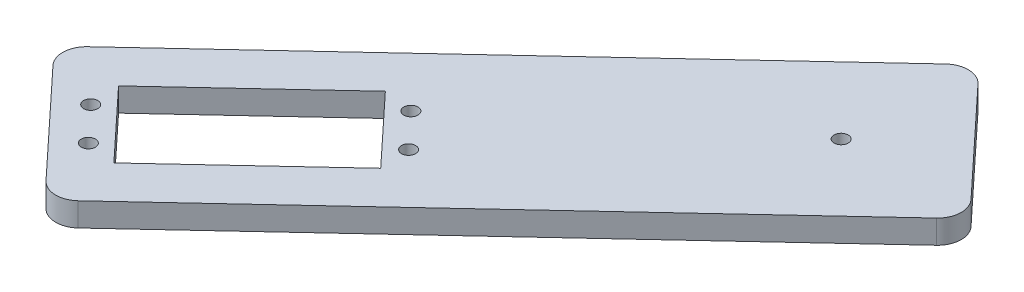
ISO-10303-21;
HEADER;
FILE_DESCRIPTION(('STEP AP214'),'2;1');
FILE_NAME('part.step','',(''),(''),'','','');
FILE_SCHEMA(('AUTOMOTIVE_DESIGN { 1 0 10303 214 1 1 1 1 }'));
ENDSEC;
DATA;
#1=APPLICATION_CONTEXT('core data for automotive mechanical design processes');
#2=APPLICATION_PROTOCOL_DEFINITION('international standard','automotive_design',2000,#1);
#3=PRODUCT_CONTEXT('',#1,'mechanical');
#4=PRODUCT('Part','Part','',(#3));
#5=PRODUCT_RELATED_PRODUCT_CATEGORY('part','',(#4));
#6=PRODUCT_DEFINITION_FORMATION('','',#4);
#7=PRODUCT_DEFINITION_CONTEXT('part definition',#1,'design');
#8=PRODUCT_DEFINITION('design','',#6,#7);
#9=PRODUCT_DEFINITION_SHAPE('','',#8);
#10=(LENGTH_UNIT() NAMED_UNIT(*) SI_UNIT(.MILLI.,.METRE.));
#11=(NAMED_UNIT(*) PLANE_ANGLE_UNIT() SI_UNIT($,.RADIAN.));
#12=(NAMED_UNIT(*) SI_UNIT($,.STERADIAN.) SOLID_ANGLE_UNIT());
#13=UNCERTAINTY_MEASURE_WITH_UNIT(LENGTH_MEASURE(1.E-05),#10,'distance_accuracy_value','');
#14=(GEOMETRIC_REPRESENTATION_CONTEXT(3) GLOBAL_UNCERTAINTY_ASSIGNED_CONTEXT((#13)) GLOBAL_UNIT_ASSIGNED_CONTEXT((#10,
#11,#12)) REPRESENTATION_CONTEXT('',''));
#15=CARTESIAN_POINT('',(0.,0.,0.));
#16=DIRECTION('',(0.,0.,1.));
#17=DIRECTION('',(1.,0.,0.));
#18=AXIS2_PLACEMENT_3D('',#15,#16,#17);
#19=CARTESIAN_POINT('',(-17.5010235742524,5.,23.5376499438813));
#20=DIRECTION('',(0.,-1.,0.));
#21=DIRECTION('',(0.,0.,-1.));
#22=AXIS2_PLACEMENT_3D('',#19,#20,#21);
#23=PLANE('',#22);
#24=CARTESIAN_POINT('',(-68.9460814642246,5.,85.1842171444905));
#25=DIRECTION('',(0.,1.,0.));
#26=DIRECTION('',(0.,0.,1.));
#27=AXIS2_PLACEMENT_3D('',#24,#25,#26);
#28=CIRCLE('',#27,1.50000000000006);
#29=CARTESIAN_POINT('',(-68.9460814642246,5.,86.6842171444906));
#30=VERTEX_POINT('',#29);
#31=EDGE_CURVE('E160',#30,#30,#28,.T.);
#32=ORIENTED_EDGE('',*,*,#31,.F.);
#33=EDGE_LOOP('',(#32));
#34=FACE_BOUND('',#33,.T.);
#35=CARTESIAN_POINT('',(-62.1260978635996,5.,92.4977541606822));
#36=DIRECTION('',(0.,1.,0.));
#37=DIRECTION('',(0.,0.,1.));
#38=AXIS2_PLACEMENT_3D('',#35,#36,#37);
#39=CIRCLE('',#38,1.50000000000006);
#40=CARTESIAN_POINT('',(-62.1260978635996,5.,93.9977541606822));
#41=VERTEX_POINT('',#40);
#42=EDGE_CURVE('E166',#41,#41,#39,.T.);
#43=ORIENTED_EDGE('',*,*,#42,.F.);
#44=EDGE_LOOP('',(#43));
#45=FACE_BOUND('',#44,.T.);
#46=CARTESIAN_POINT('',(-104.051059141945,5.,117.92013842749));
#47=DIRECTION('',(0.,1.,0.));
#48=DIRECTION('',(0.,0.,1.));
#49=AXIS2_PLACEMENT_3D('',#46,#47,#48);
#50=CIRCLE('',#49,1.50000000000006);
#51=CARTESIAN_POINT('',(-104.051059141945,5.,119.42013842749));
#52=VERTEX_POINT('',#51);
#53=EDGE_CURVE('E172',#52,#52,#50,.T.);
#54=ORIENTED_EDGE('',*,*,#53,.F.);
#55=EDGE_LOOP('',(#54));
#56=FACE_BOUND('',#55,.T.);
#57=CARTESIAN_POINT('',(-97.2310755413197,5.,125.233675443682));
#58=DIRECTION('',(0.,1.,0.));
#59=DIRECTION('',(0.,0.,1.));
#60=AXIS2_PLACEMENT_3D('',#57,#58,#59);
#61=CIRCLE('',#60,1.50000000000006);
#62=CARTESIAN_POINT('',(-97.2310755413197,5.,126.733675443682));
#63=VERTEX_POINT('',#62);
#64=EDGE_CURVE('E178',#63,#63,#61,.T.);
#65=ORIENTED_EDGE('',*,*,#64,.F.);
#66=EDGE_LOOP('',(#65));
#67=FACE_BOUND('',#66,.T.);
#68=CARTESIAN_POINT('',(-18.2413536976024,5.,44.7379308691066));
#69=DIRECTION('',(0.,1.,0.));
#70=DIRECTION('',(0.,0.,-1.));
#71=AXIS2_PLACEMENT_3D('',#68,#69,#70);
#72=CIRCLE('',#71,1.5);
#73=CARTESIAN_POINT('',(-18.2413536976024,5.,43.2379308691066));
#74=VERTEX_POINT('',#73);
#75=EDGE_CURVE('E184',#74,#74,#72,.T.);
#76=ORIENTED_EDGE('',*,*,#75,.F.);
#77=EDGE_LOOP('',(#76));
#78=FACE_BOUND('',#77,.T.);
#79=CARTESIAN_POINT('',(-17.5010235742524,5.,23.5376499438813));
#80=DIRECTION('',(0.,1.,0.));
#81=DIRECTION('',(0.,0.,-1.));
#82=AXIS2_PLACEMENT_3D('',#79,#80,#81);
#83=CIRCLE('',#82,5.00000000000009);
#84=CARTESIAN_POINT('',(-13.8442550661566,5.,20.1276581435686));
#85=VERTEX_POINT('',#84);
#86=CARTESIAN_POINT('',(-20.9110153745649,5.,19.8808814357853));
#87=VERTEX_POINT('',#86);
#88=EDGE_CURVE('E190',#85,#87,#83,.T.);
#89=ORIENTED_EDGE('',*,*,#88,.T.);
#90=DIRECTION('',(-0.731353701619178,0.,0.681998360062491));
#91=VECTOR('',#90,1.);
#92=CARTESIAN_POINT('',(-20.9110153745649,5.,19.8808814357853));
#93=LINE('',#92,#91);
#94=CARTESIAN_POINT('',(-115.012388244502,5.,107.631831263265));
#95=VERTEX_POINT('',#94);
#96=EDGE_CURVE('E193',#87,#95,#93,.T.);
#97=ORIENTED_EDGE('',*,*,#96,.T.);
#98=CARTESIAN_POINT('',(-111.602396444189,5.,111.288599771361));
#99=DIRECTION('',(0.,1.,0.));
#100=DIRECTION('',(0.,0.,1.));
#101=AXIS2_PLACEMENT_3D('',#98,#99,#100);
#102=CIRCLE('',#101,5.0000000000001);
#103=CARTESIAN_POINT('',(-115.259164952285,5.,114.698591571673));
#104=VERTEX_POINT('',#103);
#105=EDGE_CURVE('E196',#95,#104,#102,.T.);
#106=ORIENTED_EDGE('',*,*,#105,.T.);
#107=DIRECTION('',(0.681998360062492,0.,0.731353701619177));
#108=VECTOR('',#107,1.);
#109=CARTESIAN_POINT('',(-94.7992141504099,5.,136.639202620249));
#110=LINE('',#109,#108);
#111=CARTESIAN_POINT('',(-94.7992141504099,5.,136.639202620249));
#112=VERTEX_POINT('',#111);
#113=EDGE_CURVE('E198',#104,#112,#110,.T.);
#114=ORIENTED_EDGE('',*,*,#113,.T.);
#115=CARTESIAN_POINT('',(-91.1424456423142,5.,133.229210819936));
#116=DIRECTION('',(0.,1.,0.));
#117=DIRECTION('',(0.,0.,1.));
#118=AXIS2_PLACEMENT_3D('',#115,#116,#117);
#119=CIRCLE('',#118,4.99999999999985);
#120=CARTESIAN_POINT('',(-87.7324538420007,5.,136.885979328031));
#121=VERTEX_POINT('',#120);
#122=EDGE_CURVE('E200',#112,#121,#119,.T.);
#123=ORIENTED_EDGE('',*,*,#122,.T.);
#124=DIRECTION('',(0.731353701619178,0.,-0.681998360062491));
#125=VECTOR('',#124,1.);
#126=CARTESIAN_POINT('',(6.36891902793637,5.,49.1350295005515));
#127=LINE('',#126,#125);
#128=CARTESIAN_POINT('',(6.36891902793637,5.,49.1350295005515));
#129=VERTEX_POINT('',#128);
#130=EDGE_CURVE('E202',#121,#129,#127,.T.);
#131=ORIENTED_EDGE('',*,*,#130,.T.);
#132=CARTESIAN_POINT('',(2.95892722762281,5.,45.4782609924567));
#133=DIRECTION('',(0.,1.,0.));
#134=DIRECTION('',(0.,0.,-1.));
#135=AXIS2_PLACEMENT_3D('',#132,#133,#134);
#136=CIRCLE('',#135,4.99999999999985);
#137=CARTESIAN_POINT('',(6.6156957357186,5.,42.0682691921444));
#138=VERTEX_POINT('',#137);
#139=EDGE_CURVE('E204',#129,#138,#136,.T.);
#140=ORIENTED_EDGE('',*,*,#139,.T.);
#141=DIRECTION('',(-0.681998360062489,0.,-0.731353701619179));
#142=VECTOR('',#141,1.);
#143=CARTESIAN_POINT('',(6.61569573571855,5.,42.0682691921445));
#144=LINE('',#143,#142);
#145=EDGE_CURVE('E206',#138,#85,#144,.T.);
#146=ORIENTED_EDGE('',*,*,#145,.T.);
#147=EDGE_LOOP('',(#89,#97,#106,#114,#123,#131,#140,#146));
#148=FACE_BOUND('',#147,.T.);
#149=DIRECTION('',(0.6819983600625,0.,0.731353701619169));
#150=VECTOR('',#149,1.);
#151=CARTESIAN_POINT('',(-90.8956689345306,5.,126.162450511528));
#152=LINE('',#151,#150);
#153=CARTESIAN_POINT('',(-104.53563613578,5.,111.535376479145));
#154=VERTEX_POINT('',#153);
#155=CARTESIAN_POINT('',(-90.8956689345306,5.,126.162450511528));
#156=VERTEX_POINT('',#155);
#157=EDGE_CURVE('E124',#154,#156,#152,.T.);
#158=ORIENTED_EDGE('',*,*,#157,.F.);
#159=DIRECTION('',(-0.731353701619173,0.,0.681998360062495));
#160=VECTOR('',#159,1.);
#161=CARTESIAN_POINT('',(-75.2814880710133,5.,84.2554420766448));
#162=LINE('',#161,#160);
#163=CARTESIAN_POINT('',(-75.2814880710133,5.,84.2554420766448));
#164=VERTEX_POINT('',#163);
#165=EDGE_CURVE('E146',#164,#154,#162,.T.);
#166=ORIENTED_EDGE('',*,*,#165,.F.);
#167=DIRECTION('',(-0.681998360062495,0.,-0.731353701619174));
#168=VECTOR('',#167,1.);
#169=CARTESIAN_POINT('',(-61.6415208697636,5.,98.8825161090281));
#170=LINE('',#169,#168);
#171=CARTESIAN_POINT('',(-61.6415208697636,5.,98.8825161090281));
#172=VERTEX_POINT('',#171);
#173=EDGE_CURVE('E144',#172,#164,#170,.T.);
#174=ORIENTED_EDGE('',*,*,#173,.F.);
#175=DIRECTION('',(0.731353701619176,0.,-0.681998360062492));
#176=VECTOR('',#175,1.);
#177=CARTESIAN_POINT('',(-90.8956689345306,5.,126.162450511528));
#178=LINE('',#177,#176);
#179=EDGE_CURVE('E132',#156,#172,#178,.T.);
#180=ORIENTED_EDGE('',*,*,#179,.F.);
#181=EDGE_LOOP('',(#158,#166,#174,#180));
#182=FACE_BOUND('',#181,.T.);
#183=ADVANCED_FACE('F35',(#34,#45,#56,#67,#78,#148,#182),#23,.F.);
#184=CARTESIAN_POINT('',(-17.5010235742524,0.,23.5376499438813));
#185=DIRECTION('',(0.,-1.,0.));
#186=DIRECTION('',(0.,0.,-1.));
#187=AXIS2_PLACEMENT_3D('',#184,#185,#186);
#188=PLANE('',#187);
#189=CARTESIAN_POINT('',(-62.1260978635996,0.,92.4977541606822));
#190=DIRECTION('',(0.,1.,0.));
#191=DIRECTION('',(0.,0.,1.));
#192=AXIS2_PLACEMENT_3D('',#189,#190,#191);
#193=CIRCLE('',#192,1.50000000000006);
#194=CARTESIAN_POINT('',(-62.1260978635996,0.,93.9977541606822));
#195=VERTEX_POINT('',#194);
#196=EDGE_CURVE('E163',#195,#195,#193,.T.);
#197=ORIENTED_EDGE('',*,*,#196,.T.);
#198=EDGE_LOOP('',(#197));
#199=FACE_BOUND('',#198,.T.);
#200=CARTESIAN_POINT('',(-97.2310755413197,0.,125.233675443682));
#201=DIRECTION('',(0.,1.,0.));
#202=DIRECTION('',(0.,0.,1.));
#203=AXIS2_PLACEMENT_3D('',#200,#201,#202);
#204=CIRCLE('',#203,1.50000000000006);
#205=CARTESIAN_POINT('',(-97.2310755413197,0.,126.733675443682));
#206=VERTEX_POINT('',#205);
#207=EDGE_CURVE('E175',#206,#206,#204,.T.);
#208=ORIENTED_EDGE('',*,*,#207,.T.);
#209=EDGE_LOOP('',(#208));
#210=FACE_BOUND('',#209,.T.);
#211=CARTESIAN_POINT('',(-17.5010235742524,0.,23.5376499438813));
#212=DIRECTION('',(0.,1.,0.));
#213=DIRECTION('',(0.,0.,-1.));
#214=AXIS2_PLACEMENT_3D('',#211,#212,#213);
#215=CIRCLE('',#214,5.00000000000009);
#216=CARTESIAN_POINT('',(-13.8442550661566,0.,20.1276581435686));
#217=VERTEX_POINT('',#216);
#218=CARTESIAN_POINT('',(-20.9110153745649,0.,19.8808814357853));
#219=VERTEX_POINT('',#218);
#220=EDGE_CURVE('E187',#217,#219,#215,.T.);
#221=ORIENTED_EDGE('',*,*,#220,.F.);
#222=DIRECTION('',(-0.681998360062489,0.,-0.731353701619179));
#223=VECTOR('',#222,1.);
#224=CARTESIAN_POINT('',(6.61569573571855,0.,42.0682691921445));
#225=LINE('',#224,#223);
#226=CARTESIAN_POINT('',(6.6156957357186,0.,42.0682691921444));
#227=VERTEX_POINT('',#226);
#228=EDGE_CURVE('E194',#227,#217,#225,.T.);
#229=ORIENTED_EDGE('',*,*,#228,.F.);
#230=CARTESIAN_POINT('',(2.95892722762281,0.,45.4782609924567));
#231=DIRECTION('',(0.,1.,0.));
#232=DIRECTION('',(0.,0.,-1.));
#233=AXIS2_PLACEMENT_3D('',#230,#231,#232);
#234=CIRCLE('',#233,4.99999999999985);
#235=CARTESIAN_POINT('',(6.36891902793637,0.,49.1350295005515));
#236=VERTEX_POINT('',#235);
#237=EDGE_CURVE('E221',#236,#227,#234,.T.);
#238=ORIENTED_EDGE('',*,*,#237,.F.);
#239=DIRECTION('',(0.731353701619178,0.,-0.681998360062491));
#240=VECTOR('',#239,1.);
#241=CARTESIAN_POINT('',(6.36891902793637,0.,49.1350295005515));
#242=LINE('',#241,#240);
#243=CARTESIAN_POINT('',(-87.7324538420007,0.,136.885979328031));
#244=VERTEX_POINT('',#243);
#245=EDGE_CURVE('E219',#244,#236,#242,.T.);
#246=ORIENTED_EDGE('',*,*,#245,.F.);
#247=CARTESIAN_POINT('',(-91.1424456423142,0.,133.229210819936));
#248=DIRECTION('',(0.,1.,0.));
#249=DIRECTION('',(0.,0.,1.));
#250=AXIS2_PLACEMENT_3D('',#247,#248,#249);
#251=CIRCLE('',#250,4.99999999999985);
#252=CARTESIAN_POINT('',(-94.7992141504099,0.,136.639202620249));
#253=VERTEX_POINT('',#252);
#254=EDGE_CURVE('E217',#253,#244,#251,.T.);
#255=ORIENTED_EDGE('',*,*,#254,.F.);
#256=DIRECTION('',(0.681998360062492,0.,0.731353701619177));
#257=VECTOR('',#256,1.);
#258=CARTESIAN_POINT('',(-94.7992141504099,0.,136.639202620249));
#259=LINE('',#258,#257);
#260=CARTESIAN_POINT('',(-115.259164952285,0.,114.698591571673));
#261=VERTEX_POINT('',#260);
#262=EDGE_CURVE('E215',#261,#253,#259,.T.);
#263=ORIENTED_EDGE('',*,*,#262,.F.);
#264=CARTESIAN_POINT('',(-111.602396444189,0.,111.288599771361));
#265=DIRECTION('',(0.,1.,0.));
#266=DIRECTION('',(0.,0.,1.));
#267=AXIS2_PLACEMENT_3D('',#264,#265,#266);
#268=CIRCLE('',#267,5.0000000000001);
#269=CARTESIAN_POINT('',(-115.012388244502,0.,107.631831263265));
#270=VERTEX_POINT('',#269);
#271=EDGE_CURVE('E213',#270,#261,#268,.T.);
#272=ORIENTED_EDGE('',*,*,#271,.F.);
#273=DIRECTION('',(-0.731353701619178,0.,0.681998360062491));
#274=VECTOR('',#273,1.);
#275=CARTESIAN_POINT('',(-20.9110153745649,0.,19.8808814357853));
#276=LINE('',#275,#274);
#277=EDGE_CURVE('E211',#219,#270,#276,.T.);
#278=ORIENTED_EDGE('',*,*,#277,.F.);
#279=EDGE_LOOP('',(#221,#229,#238,#246,#255,#263,#272,#278));
#280=FACE_BOUND('',#279,.T.);
#281=CARTESIAN_POINT('',(-18.2413536976024,0.,44.7379308691066));
#282=DIRECTION('',(0.,1.,0.));
#283=DIRECTION('',(0.,0.,-1.));
#284=AXIS2_PLACEMENT_3D('',#281,#282,#283);
#285=CIRCLE('',#284,1.5);
#286=CARTESIAN_POINT('',(-18.2413536976024,0.,43.2379308691066));
#287=VERTEX_POINT('',#286);
#288=EDGE_CURVE('E181',#287,#287,#285,.T.);
#289=ORIENTED_EDGE('',*,*,#288,.T.);
#290=EDGE_LOOP('',(#289));
#291=FACE_BOUND('',#290,.T.);
#292=CARTESIAN_POINT('',(-104.051059141945,0.,117.92013842749));
#293=DIRECTION('',(0.,1.,0.));
#294=DIRECTION('',(0.,0.,1.));
#295=AXIS2_PLACEMENT_3D('',#292,#293,#294);
#296=CIRCLE('',#295,1.50000000000006);
#297=CARTESIAN_POINT('',(-104.051059141945,0.,119.42013842749));
#298=VERTEX_POINT('',#297);
#299=EDGE_CURVE('E169',#298,#298,#296,.T.);
#300=ORIENTED_EDGE('',*,*,#299,.T.);
#301=EDGE_LOOP('',(#300));
#302=FACE_BOUND('',#301,.T.);
#303=CARTESIAN_POINT('',(-68.9460814642246,0.,85.1842171444905));
#304=DIRECTION('',(0.,1.,0.));
#305=DIRECTION('',(0.,0.,1.));
#306=AXIS2_PLACEMENT_3D('',#303,#304,#305);
#307=CIRCLE('',#306,1.50000000000006);
#308=CARTESIAN_POINT('',(-68.9460814642246,0.,86.6842171444906));
#309=VERTEX_POINT('',#308);
#310=EDGE_CURVE('E140',#309,#309,#307,.T.);
#311=ORIENTED_EDGE('',*,*,#310,.T.);
#312=EDGE_LOOP('',(#311));
#313=FACE_BOUND('',#312,.T.);
#314=DIRECTION('',(-0.731353701619173,0.,0.681998360062495));
#315=VECTOR('',#314,1.);
#316=CARTESIAN_POINT('',(-75.2814880710133,0.,84.2554420766448));
#317=LINE('',#316,#315);
#318=CARTESIAN_POINT('',(-75.2814880710133,0.,84.2554420766448));
#319=VERTEX_POINT('',#318);
#320=CARTESIAN_POINT('',(-104.53563613578,0.,111.535376479145));
#321=VERTEX_POINT('',#320);
#322=EDGE_CURVE('E133',#319,#321,#317,.T.);
#323=ORIENTED_EDGE('',*,*,#322,.T.);
#324=DIRECTION('',(0.6819983600625,0.,0.731353701619169));
#325=VECTOR('',#324,1.);
#326=CARTESIAN_POINT('',(-90.8956689345306,0.,126.162450511528));
#327=LINE('',#326,#325);
#328=CARTESIAN_POINT('',(-90.8956689345306,0.,126.162450511528));
#329=VERTEX_POINT('',#328);
#330=EDGE_CURVE('E58',#321,#329,#327,.T.);
#331=ORIENTED_EDGE('',*,*,#330,.T.);
#332=DIRECTION('',(0.731353701619176,0.,-0.681998360062492));
#333=VECTOR('',#332,1.);
#334=CARTESIAN_POINT('',(-90.8956689345306,0.,126.162450511528));
#335=LINE('',#334,#333);
#336=CARTESIAN_POINT('',(-61.6415208697636,0.,98.8825161090281));
#337=VERTEX_POINT('',#336);
#338=EDGE_CURVE('E139',#329,#337,#335,.T.);
#339=ORIENTED_EDGE('',*,*,#338,.T.);
#340=DIRECTION('',(-0.681998360062495,0.,-0.731353701619174));
#341=VECTOR('',#340,1.);
#342=CARTESIAN_POINT('',(-61.6415208697636,0.,98.8825161090281));
#343=LINE('',#342,#341);
#344=EDGE_CURVE('E152',#337,#319,#343,.T.);
#345=ORIENTED_EDGE('',*,*,#344,.T.);
#346=EDGE_LOOP('',(#323,#331,#339,#345));
#347=FACE_BOUND('',#346,.T.);
#348=ADVANCED_FACE('F251',(#199,#210,#280,#291,#302,#313,#347),#188,.T.);
#349=CARTESIAN_POINT('',(-17.5010235742524,5.,23.5376499438813));
#350=DIRECTION('',(0.,-1.,0.));
#351=DIRECTION('',(0.,0.,-1.));
#352=AXIS2_PLACEMENT_3D('',#349,#350,#351);
#353=CYLINDRICAL_SURFACE('',#352,5.00000000000009);
#354=ORIENTED_EDGE('',*,*,#220,.T.);
#355=DIRECTION('',(0.,-1.,0.));
#356=VECTOR('',#355,1.);
#357=CARTESIAN_POINT('',(-20.9110153745649,5.,19.8808814357853));
#358=LINE('',#357,#356);
#359=EDGE_CURVE('E11',#87,#219,#358,.T.);
#360=ORIENTED_EDGE('',*,*,#359,.F.);
#361=ORIENTED_EDGE('',*,*,#88,.F.);
#362=DIRECTION('',(0.,-1.,0.));
#363=VECTOR('',#362,1.);
#364=CARTESIAN_POINT('',(-13.8442550661566,5.,20.1276581435686));
#365=LINE('',#364,#363);
#366=EDGE_CURVE('E208',#85,#217,#365,.T.);
#367=ORIENTED_EDGE('',*,*,#366,.T.);
#368=EDGE_LOOP('',(#354,#360,#361,#367));
#369=FACE_BOUND('',#368,.T.);
#370=ADVANCED_FACE('F37',(#369),#353,.T.);
#371=CARTESIAN_POINT('',(-20.9110153745649,5.,19.8808814357853));
#372=DIRECTION('',(0.681998360062491,0.,0.731353701619178));
#373=DIRECTION('',(0.731353701619178,0.,-0.681998360062491));
#374=AXIS2_PLACEMENT_3D('',#371,#372,#373);
#375=PLANE('',#374);
#376=ORIENTED_EDGE('',*,*,#277,.T.);
#377=DIRECTION('',(0.,-1.,0.));
#378=VECTOR('',#377,1.);
#379=CARTESIAN_POINT('',(-115.012388244502,5.,107.631831263265));
#380=LINE('',#379,#378);
#381=EDGE_CURVE('E43',#95,#270,#380,.T.);
#382=ORIENTED_EDGE('',*,*,#381,.F.);
#383=ORIENTED_EDGE('',*,*,#96,.F.);
#384=ORIENTED_EDGE('',*,*,#359,.T.);
#385=EDGE_LOOP('',(#376,#382,#383,#384));
#386=FACE_BOUND('',#385,.T.);
#387=ADVANCED_FACE('F268',(#386),#375,.F.);
#388=CARTESIAN_POINT('',(-111.602396444189,5.,111.288599771361));
#389=DIRECTION('',(0.,-1.,0.));
#390=DIRECTION('',(0.,0.,-1.));
#391=AXIS2_PLACEMENT_3D('',#388,#389,#390);
#392=CYLINDRICAL_SURFACE('',#391,5.0000000000001);
#393=ORIENTED_EDGE('',*,*,#271,.T.);
#394=DIRECTION('',(0.,-1.,0.));
#395=VECTOR('',#394,1.);
#396=CARTESIAN_POINT('',(-115.259164952285,5.,114.698591571673));
#397=LINE('',#396,#395);
#398=EDGE_CURVE('E238',#104,#261,#397,.T.);
#399=ORIENTED_EDGE('',*,*,#398,.F.);
#400=ORIENTED_EDGE('',*,*,#105,.F.);
#401=ORIENTED_EDGE('',*,*,#381,.T.);
#402=EDGE_LOOP('',(#393,#399,#400,#401));
#403=FACE_BOUND('',#402,.T.);
#404=ADVANCED_FACE('F245',(#403),#392,.T.);
#405=CARTESIAN_POINT('',(-94.7992141504099,5.,136.639202620249));
#406=DIRECTION('',(0.731353701619177,0.,-0.681998360062492));
#407=DIRECTION('',(-0.681998360062492,0.,-0.731353701619177));
#408=AXIS2_PLACEMENT_3D('',#405,#406,#407);
#409=PLANE('',#408);
#410=ORIENTED_EDGE('',*,*,#262,.T.);
#411=DIRECTION('',(0.,-1.,0.));
#412=VECTOR('',#411,1.);
#413=CARTESIAN_POINT('',(-94.7992141504099,5.,136.639202620249));
#414=LINE('',#413,#412);
#415=EDGE_CURVE('E235',#112,#253,#414,.T.);
#416=ORIENTED_EDGE('',*,*,#415,.F.);
#417=ORIENTED_EDGE('',*,*,#113,.F.);
#418=ORIENTED_EDGE('',*,*,#398,.T.);
#419=EDGE_LOOP('',(#410,#416,#417,#418));
#420=FACE_BOUND('',#419,.T.);
#421=ADVANCED_FACE('F257',(#420),#409,.F.);
#422=CARTESIAN_POINT('',(-91.1424456423142,5.,133.229210819936));
#423=DIRECTION('',(0.,-1.,0.));
#424=DIRECTION('',(0.,0.,-1.));
#425=AXIS2_PLACEMENT_3D('',#422,#423,#424);
#426=CYLINDRICAL_SURFACE('',#425,4.99999999999985);
#427=ORIENTED_EDGE('',*,*,#254,.T.);
#428=DIRECTION('',(0.,-1.,0.));
#429=VECTOR('',#428,1.);
#430=CARTESIAN_POINT('',(-87.7324538420007,5.,136.885979328031));
#431=LINE('',#430,#429);
#432=EDGE_CURVE('E232',#121,#244,#431,.T.);
#433=ORIENTED_EDGE('',*,*,#432,.F.);
#434=ORIENTED_EDGE('',*,*,#122,.F.);
#435=ORIENTED_EDGE('',*,*,#415,.T.);
#436=EDGE_LOOP('',(#427,#433,#434,#435));
#437=FACE_BOUND('',#436,.T.);
#438=ADVANCED_FACE('F261',(#437),#426,.T.);
#439=CARTESIAN_POINT('',(6.36891902793637,5.,49.1350295005515));
#440=DIRECTION('',(-0.681998360062491,0.,-0.731353701619178));
#441=DIRECTION('',(-0.731353701619178,0.,0.681998360062491));
#442=AXIS2_PLACEMENT_3D('',#439,#440,#441);
#443=PLANE('',#442);
#444=ORIENTED_EDGE('',*,*,#245,.T.);
#445=DIRECTION('',(0.,-1.,0.));
#446=VECTOR('',#445,1.);
#447=CARTESIAN_POINT('',(6.36891902793637,5.,49.1350295005515));
#448=LINE('',#447,#446);
#449=EDGE_CURVE('E229',#129,#236,#448,.T.);
#450=ORIENTED_EDGE('',*,*,#449,.F.);
#451=ORIENTED_EDGE('',*,*,#130,.F.);
#452=ORIENTED_EDGE('',*,*,#432,.T.);
#453=EDGE_LOOP('',(#444,#450,#451,#452));
#454=FACE_BOUND('',#453,.T.);
#455=ADVANCED_FACE('F281',(#454),#443,.F.);
#456=CARTESIAN_POINT('',(2.95892722762281,5.,45.4782609924567));
#457=DIRECTION('',(0.,-1.,0.));
#458=DIRECTION('',(0.,0.,-1.));
#459=AXIS2_PLACEMENT_3D('',#456,#457,#458);
#460=CYLINDRICAL_SURFACE('',#459,4.99999999999985);
#461=ORIENTED_EDGE('',*,*,#237,.T.);
#462=DIRECTION('',(0.,-1.,0.));
#463=VECTOR('',#462,1.);
#464=CARTESIAN_POINT('',(6.6156957357186,5.,42.0682691921444));
#465=LINE('',#464,#463);
#466=EDGE_CURVE('E226',#138,#227,#465,.T.);
#467=ORIENTED_EDGE('',*,*,#466,.F.);
#468=ORIENTED_EDGE('',*,*,#139,.F.);
#469=ORIENTED_EDGE('',*,*,#449,.T.);
#470=EDGE_LOOP('',(#461,#467,#468,#469));
#471=FACE_BOUND('',#470,.T.);
#472=ADVANCED_FACE('F279',(#471),#460,.T.);
#473=CARTESIAN_POINT('',(6.61569573571855,5.,42.0682691921445));
#474=DIRECTION('',(-0.731353701619179,0.,0.68199836006249));
#475=DIRECTION('',(0.68199836006249,0.,0.731353701619179));
#476=AXIS2_PLACEMENT_3D('',#473,#474,#475);
#477=PLANE('',#476);
#478=ORIENTED_EDGE('',*,*,#228,.T.);
#479=ORIENTED_EDGE('',*,*,#366,.F.);
#480=ORIENTED_EDGE('',*,*,#145,.F.);
#481=ORIENTED_EDGE('',*,*,#466,.T.);
#482=EDGE_LOOP('',(#478,#479,#480,#481));
#483=FACE_BOUND('',#482,.T.);
#484=ADVANCED_FACE('F274',(#483),#477,.F.);
#485=CARTESIAN_POINT('',(-18.2413536976024,5.,44.7379308691066));
#486=DIRECTION('',(0.,-1.,0.));
#487=DIRECTION('',(0.,0.,-1.));
#488=AXIS2_PLACEMENT_3D('',#485,#486,#487);
#489=CYLINDRICAL_SURFACE('',#488,1.5);
#490=ORIENTED_EDGE('',*,*,#75,.T.);
#491=EDGE_LOOP('',(#490));
#492=FACE_BOUND('',#491,.T.);
#493=ORIENTED_EDGE('',*,*,#288,.F.);
#494=EDGE_LOOP('',(#493));
#495=FACE_BOUND('',#494,.T.);
#496=ADVANCED_FACE('F301',(#492,#495),#489,.F.);
#497=CARTESIAN_POINT('',(-97.2310755413197,5.,125.233675443682));
#498=DIRECTION('',(0.,-1.,0.));
#499=DIRECTION('',(0.,0.,-1.));
#500=AXIS2_PLACEMENT_3D('',#497,#498,#499);
#501=CYLINDRICAL_SURFACE('',#500,1.50000000000006);
#502=ORIENTED_EDGE('',*,*,#64,.T.);
#503=EDGE_LOOP('',(#502));
#504=FACE_BOUND('',#503,.T.);
#505=ORIENTED_EDGE('',*,*,#207,.F.);
#506=EDGE_LOOP('',(#505));
#507=FACE_BOUND('',#506,.T.);
#508=ADVANCED_FACE('F308',(#504,#507),#501,.F.);
#509=CARTESIAN_POINT('',(-104.051059141945,5.,117.92013842749));
#510=DIRECTION('',(0.,-1.,0.));
#511=DIRECTION('',(0.,0.,-1.));
#512=AXIS2_PLACEMENT_3D('',#509,#510,#511);
#513=CYLINDRICAL_SURFACE('',#512,1.50000000000006);
#514=ORIENTED_EDGE('',*,*,#53,.T.);
#515=EDGE_LOOP('',(#514));
#516=FACE_BOUND('',#515,.T.);
#517=ORIENTED_EDGE('',*,*,#299,.F.);
#518=EDGE_LOOP('',(#517));
#519=FACE_BOUND('',#518,.T.);
#520=ADVANCED_FACE('F313',(#516,#519),#513,.F.);
#521=CARTESIAN_POINT('',(-62.1260978635996,5.,92.4977541606822));
#522=DIRECTION('',(0.,-1.,0.));
#523=DIRECTION('',(0.,0.,-1.));
#524=AXIS2_PLACEMENT_3D('',#521,#522,#523);
#525=CYLINDRICAL_SURFACE('',#524,1.50000000000006);
#526=ORIENTED_EDGE('',*,*,#42,.T.);
#527=EDGE_LOOP('',(#526));
#528=FACE_BOUND('',#527,.T.);
#529=ORIENTED_EDGE('',*,*,#196,.F.);
#530=EDGE_LOOP('',(#529));
#531=FACE_BOUND('',#530,.T.);
#532=ADVANCED_FACE('F341',(#528,#531),#525,.F.);
#533=CARTESIAN_POINT('',(-68.9460814642246,5.,85.1842171444905));
#534=DIRECTION('',(0.,-1.,0.));
#535=DIRECTION('',(0.,0.,-1.));
#536=AXIS2_PLACEMENT_3D('',#533,#534,#535);
#537=CYLINDRICAL_SURFACE('',#536,1.50000000000006);
#538=ORIENTED_EDGE('',*,*,#31,.T.);
#539=EDGE_LOOP('',(#538));
#540=FACE_BOUND('',#539,.T.);
#541=ORIENTED_EDGE('',*,*,#310,.F.);
#542=EDGE_LOOP('',(#541));
#543=FACE_BOUND('',#542,.T.);
#544=ADVANCED_FACE('F338',(#540,#543),#537,.F.);
#545=CARTESIAN_POINT('',(-90.8956689345306,5.,126.162450511528));
#546=DIRECTION('',(0.731353701619169,0.,-0.6819983600625));
#547=DIRECTION('',(-0.6819983600625,0.,-0.731353701619169));
#548=AXIS2_PLACEMENT_3D('',#545,#546,#547);
#549=PLANE('',#548);
#550=ORIENTED_EDGE('',*,*,#330,.F.);
#551=DIRECTION('',(0.,-1.,0.));
#552=VECTOR('',#551,1.);
#553=CARTESIAN_POINT('',(-104.53563613578,5.,111.535376479145));
#554=LINE('',#553,#552);
#555=EDGE_CURVE('E128',#154,#321,#554,.T.);
#556=ORIENTED_EDGE('',*,*,#555,.F.);
#557=ORIENTED_EDGE('',*,*,#157,.T.);
#558=DIRECTION('',(0.,-1.,0.));
#559=VECTOR('',#558,1.);
#560=CARTESIAN_POINT('',(-90.8956689345306,5.,126.162450511528));
#561=LINE('',#560,#559);
#562=EDGE_CURVE('E127',#156,#329,#561,.T.);
#563=ORIENTED_EDGE('',*,*,#562,.T.);
#564=EDGE_LOOP('',(#550,#556,#557,#563));
#565=FACE_BOUND('',#564,.T.);
#566=ADVANCED_FACE('F126',(#565),#549,.T.);
#567=CARTESIAN_POINT('',(-90.8956689345306,5.,126.162450511528));
#568=DIRECTION('',(-0.681998360062492,0.,-0.731353701619176));
#569=DIRECTION('',(-0.731353701619176,0.,0.681998360062492));
#570=AXIS2_PLACEMENT_3D('',#567,#568,#569);
#571=PLANE('',#570);
#572=ORIENTED_EDGE('',*,*,#338,.F.);
#573=ORIENTED_EDGE('',*,*,#562,.F.);
#574=ORIENTED_EDGE('',*,*,#179,.T.);
#575=DIRECTION('',(0.,-1.,0.));
#576=VECTOR('',#575,1.);
#577=CARTESIAN_POINT('',(-61.6415208697636,5.,98.8825161090281));
#578=LINE('',#577,#576);
#579=EDGE_CURVE('E141',#172,#337,#578,.T.);
#580=ORIENTED_EDGE('',*,*,#579,.T.);
#581=EDGE_LOOP('',(#572,#573,#574,#580));
#582=FACE_BOUND('',#581,.T.);
#583=ADVANCED_FACE('F136',(#582),#571,.T.);
#584=CARTESIAN_POINT('',(-61.6415208697636,5.,98.8825161090281));
#585=DIRECTION('',(-0.731353701619174,0.,0.681998360062495));
#586=DIRECTION('',(0.681998360062495,0.,0.731353701619174));
#587=AXIS2_PLACEMENT_3D('',#584,#585,#586);
#588=PLANE('',#587);
#589=ORIENTED_EDGE('',*,*,#344,.F.);
#590=ORIENTED_EDGE('',*,*,#579,.F.);
#591=ORIENTED_EDGE('',*,*,#173,.T.);
#592=DIRECTION('',(0.,-1.,0.));
#593=VECTOR('',#592,1.);
#594=CARTESIAN_POINT('',(-75.2814880710133,5.,84.2554420766448));
#595=LINE('',#594,#593);
#596=EDGE_CURVE('E50',#164,#319,#595,.T.);
#597=ORIENTED_EDGE('',*,*,#596,.T.);
#598=EDGE_LOOP('',(#589,#590,#591,#597));
#599=FACE_BOUND('',#598,.T.);
#600=ADVANCED_FACE('F326',(#599),#588,.T.);
#601=CARTESIAN_POINT('',(-75.2814880710133,5.,84.2554420766448));
#602=DIRECTION('',(0.681998360062495,0.,0.731353701619173));
#603=DIRECTION('',(0.731353701619173,0.,-0.681998360062495));
#604=AXIS2_PLACEMENT_3D('',#601,#602,#603);
#605=PLANE('',#604);
#606=ORIENTED_EDGE('',*,*,#322,.F.);
#607=ORIENTED_EDGE('',*,*,#596,.F.);
#608=ORIENTED_EDGE('',*,*,#165,.T.);
#609=ORIENTED_EDGE('',*,*,#555,.T.);
#610=EDGE_LOOP('',(#606,#607,#608,#609));
#611=FACE_BOUND('',#610,.T.);
#612=ADVANCED_FACE('F324',(#611),#605,.T.);
#613=CLOSED_SHELL('',(#183,#348,#370,#387,#404,#421,#438,#455,#472,#484,#496,#508,#520,#532,
#544,#566,#583,#600,#612));
#614=MANIFOLD_SOLID_BREP('B2',#613);
#615=ADVANCED_BREP_SHAPE_REPRESENTATION('',(#18,#614),#14);
#616=SHAPE_DEFINITION_REPRESENTATION(#9,#615);
ENDSEC;
END-ISO-10303-21;
